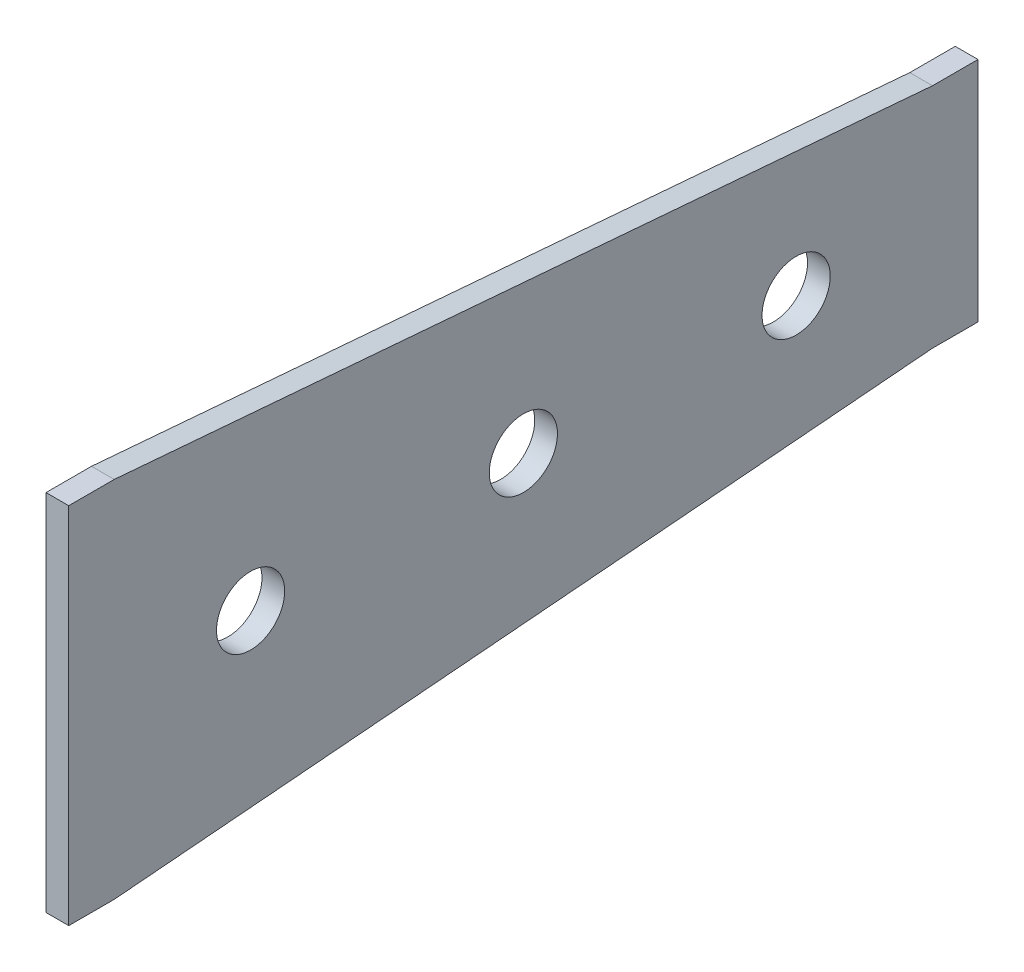
ISO-10303-21;
HEADER;
FILE_DESCRIPTION(('STEP AP214'),'2;1');
FILE_NAME('part.step','',(''),(''),'','','');
FILE_SCHEMA(('AUTOMOTIVE_DESIGN { 1 0 10303 214 1 1 1 1 }'));
ENDSEC;
DATA;
#1=APPLICATION_CONTEXT('core data for automotive mechanical design processes');
#2=APPLICATION_PROTOCOL_DEFINITION('international standard','automotive_design',2000,#1);
#3=PRODUCT_CONTEXT('',#1,'mechanical');
#4=PRODUCT('Part','Part','',(#3));
#5=PRODUCT_RELATED_PRODUCT_CATEGORY('part','',(#4));
#6=PRODUCT_DEFINITION_FORMATION('','',#4);
#7=PRODUCT_DEFINITION_CONTEXT('part definition',#1,'design');
#8=PRODUCT_DEFINITION('design','',#6,#7);
#9=PRODUCT_DEFINITION_SHAPE('','',#8);
#10=(LENGTH_UNIT() NAMED_UNIT(*) SI_UNIT(.MILLI.,.METRE.));
#11=(NAMED_UNIT(*) PLANE_ANGLE_UNIT() SI_UNIT($,.RADIAN.));
#12=(NAMED_UNIT(*) SI_UNIT($,.STERADIAN.) SOLID_ANGLE_UNIT());
#13=UNCERTAINTY_MEASURE_WITH_UNIT(LENGTH_MEASURE(1.E-05),#10,'distance_accuracy_value','');
#14=(GEOMETRIC_REPRESENTATION_CONTEXT(3) GLOBAL_UNCERTAINTY_ASSIGNED_CONTEXT((#13)) GLOBAL_UNIT_ASSIGNED_CONTEXT((#10,
#11,#12)) REPRESENTATION_CONTEXT('',''));
#15=CARTESIAN_POINT('',(0.,0.,0.));
#16=DIRECTION('',(0.,0.,1.));
#17=DIRECTION('',(1.,0.,0.));
#18=AXIS2_PLACEMENT_3D('',#15,#16,#17);
#19=CARTESIAN_POINT('',(2.5,0.,0.));
#20=DIRECTION('',(1.,0.,0.));
#21=DIRECTION('',(0.,0.,-1.));
#22=AXIS2_PLACEMENT_3D('',#19,#20,#21);
#23=PLANE('',#22);
#24=CARTESIAN_POINT('',(2.5,0.,60.));
#25=DIRECTION('',(1.,0.,0.));
#26=DIRECTION('',(0.,0.,-1.));
#27=AXIS2_PLACEMENT_3D('',#24,#25,#26);
#28=CIRCLE('',#27,7.50000000000001);
#29=CARTESIAN_POINT('',(2.5,0.,52.5));
#30=VERTEX_POINT('',#29);
#31=EDGE_CURVE('E222',#30,#30,#28,.T.);
#32=ORIENTED_EDGE('',*,*,#31,.F.);
#33=EDGE_LOOP('',(#32));
#34=FACE_BOUND('',#33,.T.);
#35=DIRECTION('',(0.,0.,1.));
#36=VECTOR('',#35,1.);
#37=CARTESIAN_POINT('',(2.5,40.,100.));
#38=LINE('',#37,#36);
#39=CARTESIAN_POINT('',(2.5,40.,90.));
#40=VERTEX_POINT('',#39);
#41=CARTESIAN_POINT('',(2.5,40.,100.));
#42=VERTEX_POINT('',#41);
#43=EDGE_CURVE('E176',#40,#42,#38,.T.);
#44=ORIENTED_EDGE('',*,*,#43,.T.);
#45=DIRECTION('',(0.,-1.,0.));
#46=VECTOR('',#45,1.);
#47=CARTESIAN_POINT('',(2.5,40.,100.));
#48=LINE('',#47,#46);
#49=CARTESIAN_POINT('',(2.5,-40.,100.));
#50=VERTEX_POINT('',#49);
#51=EDGE_CURVE('E111',#42,#50,#48,.T.);
#52=ORIENTED_EDGE('',*,*,#51,.T.);
#53=DIRECTION('',(0.,0.,-1.));
#54=VECTOR('',#53,1.);
#55=CARTESIAN_POINT('',(2.5,-40.,100.));
#56=LINE('',#55,#54);
#57=CARTESIAN_POINT('',(2.5,-40.,90.));
#58=VERTEX_POINT('',#57);
#59=EDGE_CURVE('E196',#50,#58,#56,.T.);
#60=ORIENTED_EDGE('',*,*,#59,.T.);
#61=DIRECTION('',(0.,0.08304547985374,-0.99654575824488));
#62=VECTOR('',#61,1.);
#63=CARTESIAN_POINT('',(2.5,-25.,-90.));
#64=LINE('',#63,#62);
#65=CARTESIAN_POINT('',(2.5,-25.,-90.));
#66=VERTEX_POINT('',#65);
#67=EDGE_CURVE('E209',#58,#66,#64,.T.);
#68=ORIENTED_EDGE('',*,*,#67,.T.);
#69=DIRECTION('',(0.,0.,-1.));
#70=VECTOR('',#69,1.);
#71=CARTESIAN_POINT('',(2.5,-25.,-100.));
#72=LINE('',#71,#70);
#73=CARTESIAN_POINT('',(2.5,-25.,-100.));
#74=VERTEX_POINT('',#73);
#75=EDGE_CURVE('E131',#66,#74,#72,.T.);
#76=ORIENTED_EDGE('',*,*,#75,.T.);
#77=DIRECTION('',(0.,1.,0.));
#78=VECTOR('',#77,1.);
#79=CARTESIAN_POINT('',(2.5,-25.,-100.));
#80=LINE('',#79,#78);
#81=CARTESIAN_POINT('',(2.5,25.,-100.));
#82=VERTEX_POINT('',#81);
#83=EDGE_CURVE('E125',#74,#82,#80,.T.);
#84=ORIENTED_EDGE('',*,*,#83,.T.);
#85=DIRECTION('',(0.,0.,1.));
#86=VECTOR('',#85,1.);
#87=CARTESIAN_POINT('',(2.5,25.,-100.));
#88=LINE('',#87,#86);
#89=CARTESIAN_POINT('',(2.5,25.,-90.));
#90=VERTEX_POINT('',#89);
#91=EDGE_CURVE('E129',#82,#90,#88,.T.);
#92=ORIENTED_EDGE('',*,*,#91,.T.);
#93=DIRECTION('',(0.,0.08304547985374,0.99654575824488));
#94=VECTOR('',#93,1.);
#95=CARTESIAN_POINT('',(2.5,25.,-90.));
#96=LINE('',#95,#94);
#97=EDGE_CURVE('E60',#90,#40,#96,.T.);
#98=ORIENTED_EDGE('',*,*,#97,.T.);
#99=EDGE_LOOP('',(#44,#52,#60,#68,#76,#84,#92,#98));
#100=FACE_BOUND('',#99,.T.);
#101=CARTESIAN_POINT('',(2.5,0.,0.));
#102=DIRECTION('',(1.,0.,0.));
#103=DIRECTION('',(0.,0.,-1.));
#104=AXIS2_PLACEMENT_3D('',#101,#102,#103);
#105=CIRCLE('',#104,7.5);
#106=CARTESIAN_POINT('',(2.5,0.,-7.5));
#107=VERTEX_POINT('',#106);
#108=EDGE_CURVE('E160',#107,#107,#105,.T.);
#109=ORIENTED_EDGE('',*,*,#108,.F.);
#110=EDGE_LOOP('',(#109));
#111=FACE_BOUND('',#110,.T.);
#112=CARTESIAN_POINT('',(2.5,0.,-60.));
#113=DIRECTION('',(1.,0.,0.));
#114=DIRECTION('',(0.,0.,-1.));
#115=AXIS2_PLACEMENT_3D('',#112,#113,#114);
#116=CIRCLE('',#115,7.50000000000001);
#117=CARTESIAN_POINT('',(2.5,0.,-67.5));
#118=VERTEX_POINT('',#117);
#119=EDGE_CURVE('E230',#118,#118,#116,.T.);
#120=ORIENTED_EDGE('',*,*,#119,.F.);
#121=EDGE_LOOP('',(#120));
#122=FACE_BOUND('',#121,.T.);
#123=ADVANCED_FACE('F39',(#34,#100,#111,#122),#23,.T.);
#124=CARTESIAN_POINT('',(-2.5,0.,0.));
#125=DIRECTION('',(1.,0.,0.));
#126=DIRECTION('',(0.,0.,-1.));
#127=AXIS2_PLACEMENT_3D('',#124,#125,#126);
#128=PLANE('',#127);
#129=DIRECTION('',(0.,0.,1.));
#130=VECTOR('',#129,1.);
#131=CARTESIAN_POINT('',(-2.5,40.,100.));
#132=LINE('',#131,#130);
#133=CARTESIAN_POINT('',(-2.5,40.,90.));
#134=VERTEX_POINT('',#133);
#135=CARTESIAN_POINT('',(-2.5,40.,100.));
#136=VERTEX_POINT('',#135);
#137=EDGE_CURVE('E155',#134,#136,#132,.T.);
#138=ORIENTED_EDGE('',*,*,#137,.F.);
#139=DIRECTION('',(0.,0.08304547985374,0.99654575824488));
#140=VECTOR('',#139,1.);
#141=CARTESIAN_POINT('',(-2.5,25.,-90.));
#142=LINE('',#141,#140);
#143=CARTESIAN_POINT('',(-2.5,25.,-90.));
#144=VERTEX_POINT('',#143);
#145=EDGE_CURVE('E103',#144,#134,#142,.T.);
#146=ORIENTED_EDGE('',*,*,#145,.F.);
#147=DIRECTION('',(0.,0.,1.));
#148=VECTOR('',#147,1.);
#149=CARTESIAN_POINT('',(-2.5,25.,-100.));
#150=LINE('',#149,#148);
#151=CARTESIAN_POINT('',(-2.5,25.,-100.));
#152=VERTEX_POINT('',#151);
#153=EDGE_CURVE('E95',#152,#144,#150,.T.);
#154=ORIENTED_EDGE('',*,*,#153,.F.);
#155=DIRECTION('',(0.,1.,0.));
#156=VECTOR('',#155,1.);
#157=CARTESIAN_POINT('',(-2.5,-25.,-100.));
#158=LINE('',#157,#156);
#159=CARTESIAN_POINT('',(-2.5,-25.,-100.));
#160=VERTEX_POINT('',#159);
#161=EDGE_CURVE('E140',#160,#152,#158,.T.);
#162=ORIENTED_EDGE('',*,*,#161,.F.);
#163=DIRECTION('',(0.,0.,-1.));
#164=VECTOR('',#163,1.);
#165=CARTESIAN_POINT('',(-2.5,-25.,-100.));
#166=LINE('',#165,#164);
#167=CARTESIAN_POINT('',(-2.5,-25.,-90.));
#168=VERTEX_POINT('',#167);
#169=EDGE_CURVE('E169',#168,#160,#166,.T.);
#170=ORIENTED_EDGE('',*,*,#169,.F.);
#171=DIRECTION('',(0.,0.08304547985374,-0.99654575824488));
#172=VECTOR('',#171,1.);
#173=CARTESIAN_POINT('',(-2.5,-25.,-90.));
#174=LINE('',#173,#172);
#175=CARTESIAN_POINT('',(-2.5,-40.,90.));
#176=VERTEX_POINT('',#175);
#177=EDGE_CURVE('E166',#176,#168,#174,.T.);
#178=ORIENTED_EDGE('',*,*,#177,.F.);
#179=DIRECTION('',(0.,0.,-1.));
#180=VECTOR('',#179,1.);
#181=CARTESIAN_POINT('',(-2.5,-40.,100.));
#182=LINE('',#181,#180);
#183=CARTESIAN_POINT('',(-2.5,-40.,100.));
#184=VERTEX_POINT('',#183);
#185=EDGE_CURVE('E163',#184,#176,#182,.T.);
#186=ORIENTED_EDGE('',*,*,#185,.F.);
#187=DIRECTION('',(0.,-1.,0.));
#188=VECTOR('',#187,1.);
#189=CARTESIAN_POINT('',(-2.5,40.,100.));
#190=LINE('',#189,#188);
#191=EDGE_CURVE('E159',#136,#184,#190,.T.);
#192=ORIENTED_EDGE('',*,*,#191,.F.);
#193=EDGE_LOOP('',(#138,#146,#154,#162,#170,#178,#186,#192));
#194=FACE_BOUND('',#193,.T.);
#195=CARTESIAN_POINT('',(-2.5,0.,0.));
#196=DIRECTION('',(1.,0.,0.));
#197=DIRECTION('',(0.,0.,-1.));
#198=AXIS2_PLACEMENT_3D('',#195,#196,#197);
#199=CIRCLE('',#198,7.5);
#200=CARTESIAN_POINT('',(-2.5,0.,-7.5));
#201=VERTEX_POINT('',#200);
#202=EDGE_CURVE('E218',#201,#201,#199,.T.);
#203=ORIENTED_EDGE('',*,*,#202,.T.);
#204=EDGE_LOOP('',(#203));
#205=FACE_BOUND('',#204,.T.);
#206=CARTESIAN_POINT('',(-2.5,0.,60.));
#207=DIRECTION('',(1.,0.,0.));
#208=DIRECTION('',(0.,0.,-1.));
#209=AXIS2_PLACEMENT_3D('',#206,#207,#208);
#210=CIRCLE('',#209,7.50000000000001);
#211=CARTESIAN_POINT('',(-2.5,0.,52.5));
#212=VERTEX_POINT('',#211);
#213=EDGE_CURVE('E226',#212,#212,#210,.T.);
#214=ORIENTED_EDGE('',*,*,#213,.T.);
#215=EDGE_LOOP('',(#214));
#216=FACE_BOUND('',#215,.T.);
#217=CARTESIAN_POINT('',(-2.5,0.,-60.));
#218=DIRECTION('',(1.,0.,0.));
#219=DIRECTION('',(0.,0.,-1.));
#220=AXIS2_PLACEMENT_3D('',#217,#218,#219);
#221=CIRCLE('',#220,7.50000000000001);
#222=CARTESIAN_POINT('',(-2.5,0.,-67.5));
#223=VERTEX_POINT('',#222);
#224=EDGE_CURVE('E234',#223,#223,#221,.T.);
#225=ORIENTED_EDGE('',*,*,#224,.T.);
#226=EDGE_LOOP('',(#225));
#227=FACE_BOUND('',#226,.T.);
#228=ADVANCED_FACE('F200',(#194,#205,#216,#227),#128,.F.);
#229=CARTESIAN_POINT('',(2.5,40.,100.));
#230=DIRECTION('',(0.,-1.,0.));
#231=DIRECTION('',(0.,0.,-1.));
#232=AXIS2_PLACEMENT_3D('',#229,#230,#231);
#233=PLANE('',#232);
#234=ORIENTED_EDGE('',*,*,#137,.T.);
#235=DIRECTION('',(-1.,0.,0.));
#236=VECTOR('',#235,1.);
#237=CARTESIAN_POINT('',(2.5,40.,100.));
#238=LINE('',#237,#236);
#239=EDGE_CURVE('E11',#42,#136,#238,.T.);
#240=ORIENTED_EDGE('',*,*,#239,.F.);
#241=ORIENTED_EDGE('',*,*,#43,.F.);
#242=DIRECTION('',(-1.,0.,0.));
#243=VECTOR('',#242,1.);
#244=CARTESIAN_POINT('',(2.5,40.,90.));
#245=LINE('',#244,#243);
#246=EDGE_CURVE('E151',#40,#134,#245,.T.);
#247=ORIENTED_EDGE('',*,*,#246,.T.);
#248=EDGE_LOOP('',(#234,#240,#241,#247));
#249=FACE_BOUND('',#248,.T.);
#250=ADVANCED_FACE('F41',(#249),#233,.F.);
#251=CARTESIAN_POINT('',(2.5,40.,100.));
#252=DIRECTION('',(0.,0.,-1.));
#253=DIRECTION('',(-1.,0.,0.));
#254=AXIS2_PLACEMENT_3D('',#251,#252,#253);
#255=PLANE('',#254);
#256=ORIENTED_EDGE('',*,*,#191,.T.);
#257=DIRECTION('',(-1.,0.,0.));
#258=VECTOR('',#257,1.);
#259=CARTESIAN_POINT('',(2.5,-40.,100.));
#260=LINE('',#259,#258);
#261=EDGE_CURVE('E49',#50,#184,#260,.T.);
#262=ORIENTED_EDGE('',*,*,#261,.F.);
#263=ORIENTED_EDGE('',*,*,#51,.F.);
#264=ORIENTED_EDGE('',*,*,#239,.T.);
#265=EDGE_LOOP('',(#256,#262,#263,#264));
#266=FACE_BOUND('',#265,.T.);
#267=ADVANCED_FACE('F268',(#266),#255,.F.);
#268=CARTESIAN_POINT('',(2.5,-40.,100.));
#269=DIRECTION('',(0.,1.,0.));
#270=DIRECTION('',(0.,0.,1.));
#271=AXIS2_PLACEMENT_3D('',#268,#269,#270);
#272=PLANE('',#271);
#273=ORIENTED_EDGE('',*,*,#185,.T.);
#274=DIRECTION('',(-1.,0.,0.));
#275=VECTOR('',#274,1.);
#276=CARTESIAN_POINT('',(2.5,-40.,90.));
#277=LINE('',#276,#275);
#278=EDGE_CURVE('E184',#58,#176,#277,.T.);
#279=ORIENTED_EDGE('',*,*,#278,.F.);
#280=ORIENTED_EDGE('',*,*,#59,.F.);
#281=ORIENTED_EDGE('',*,*,#261,.T.);
#282=EDGE_LOOP('',(#273,#279,#280,#281));
#283=FACE_BOUND('',#282,.T.);
#284=ADVANCED_FACE('F194',(#283),#272,.F.);
#285=CARTESIAN_POINT('',(2.5,-25.,-90.));
#286=DIRECTION('',(0.,0.99654575824488,0.08304547985374));
#287=DIRECTION('',(0.,-0.08304547985374,0.99654575824488));
#288=AXIS2_PLACEMENT_3D('',#285,#286,#287);
#289=PLANE('',#288);
#290=ORIENTED_EDGE('',*,*,#177,.T.);
#291=DIRECTION('',(-1.,0.,0.));
#292=VECTOR('',#291,1.);
#293=CARTESIAN_POINT('',(2.5,-25.,-90.));
#294=LINE('',#293,#292);
#295=EDGE_CURVE('E181',#66,#168,#294,.T.);
#296=ORIENTED_EDGE('',*,*,#295,.F.);
#297=ORIENTED_EDGE('',*,*,#67,.F.);
#298=ORIENTED_EDGE('',*,*,#278,.T.);
#299=EDGE_LOOP('',(#290,#296,#297,#298));
#300=FACE_BOUND('',#299,.T.);
#301=ADVANCED_FACE('F205',(#300),#289,.F.);
#302=CARTESIAN_POINT('',(2.5,-25.,-100.));
#303=DIRECTION('',(0.,1.,0.));
#304=DIRECTION('',(0.,0.,1.));
#305=AXIS2_PLACEMENT_3D('',#302,#303,#304);
#306=PLANE('',#305);
#307=ORIENTED_EDGE('',*,*,#169,.T.);
#308=DIRECTION('',(-1.,0.,0.));
#309=VECTOR('',#308,1.);
#310=CARTESIAN_POINT('',(2.5,-25.,-100.));
#311=LINE('',#310,#309);
#312=EDGE_CURVE('E142',#74,#160,#311,.T.);
#313=ORIENTED_EDGE('',*,*,#312,.F.);
#314=ORIENTED_EDGE('',*,*,#75,.F.);
#315=ORIENTED_EDGE('',*,*,#295,.T.);
#316=EDGE_LOOP('',(#307,#313,#314,#315));
#317=FACE_BOUND('',#316,.T.);
#318=ADVANCED_FACE('F208',(#317),#306,.F.);
#319=CARTESIAN_POINT('',(2.5,-25.,-100.));
#320=DIRECTION('',(0.,0.,1.));
#321=DIRECTION('',(1.,0.,0.));
#322=AXIS2_PLACEMENT_3D('',#319,#320,#321);
#323=PLANE('',#322);
#324=ORIENTED_EDGE('',*,*,#161,.T.);
#325=DIRECTION('',(-1.,0.,0.));
#326=VECTOR('',#325,1.);
#327=CARTESIAN_POINT('',(2.5,25.,-100.));
#328=LINE('',#327,#326);
#329=EDGE_CURVE('E137',#82,#152,#328,.T.);
#330=ORIENTED_EDGE('',*,*,#329,.F.);
#331=ORIENTED_EDGE('',*,*,#83,.F.);
#332=ORIENTED_EDGE('',*,*,#312,.T.);
#333=EDGE_LOOP('',(#324,#330,#331,#332));
#334=FACE_BOUND('',#333,.T.);
#335=ADVANCED_FACE('F138',(#334),#323,.F.);
#336=CARTESIAN_POINT('',(2.5,25.,-100.));
#337=DIRECTION('',(0.,-1.,0.));
#338=DIRECTION('',(0.,0.,-1.));
#339=AXIS2_PLACEMENT_3D('',#336,#337,#338);
#340=PLANE('',#339);
#341=ORIENTED_EDGE('',*,*,#153,.T.);
#342=DIRECTION('',(-1.,0.,0.));
#343=VECTOR('',#342,1.);
#344=CARTESIAN_POINT('',(2.5,25.,-90.));
#345=LINE('',#344,#343);
#346=EDGE_CURVE('E143',#90,#144,#345,.T.);
#347=ORIENTED_EDGE('',*,*,#346,.F.);
#348=ORIENTED_EDGE('',*,*,#91,.F.);
#349=ORIENTED_EDGE('',*,*,#329,.T.);
#350=EDGE_LOOP('',(#341,#347,#348,#349));
#351=FACE_BOUND('',#350,.T.);
#352=ADVANCED_FACE('F145',(#351),#340,.F.);
#353=CARTESIAN_POINT('',(2.5,25.,-90.));
#354=DIRECTION('',(0.,-0.99654575824488,0.08304547985374));
#355=DIRECTION('',(0.,-0.08304547985374,-0.99654575824488));
#356=AXIS2_PLACEMENT_3D('',#353,#354,#355);
#357=PLANE('',#356);
#358=ORIENTED_EDGE('',*,*,#145,.T.);
#359=ORIENTED_EDGE('',*,*,#246,.F.);
#360=ORIENTED_EDGE('',*,*,#97,.F.);
#361=ORIENTED_EDGE('',*,*,#346,.T.);
#362=EDGE_LOOP('',(#358,#359,#360,#361));
#363=FACE_BOUND('',#362,.T.);
#364=ADVANCED_FACE('F256',(#363),#357,.F.);
#365=CARTESIAN_POINT('',(2.5,0.,0.));
#366=DIRECTION('',(-1.,0.,0.));
#367=DIRECTION('',(0.,0.,1.));
#368=AXIS2_PLACEMENT_3D('',#365,#366,#367);
#369=CYLINDRICAL_SURFACE('',#368,7.5);
#370=ORIENTED_EDGE('',*,*,#108,.T.);
#371=EDGE_LOOP('',(#370));
#372=FACE_BOUND('',#371,.T.);
#373=ORIENTED_EDGE('',*,*,#202,.F.);
#374=EDGE_LOOP('',(#373));
#375=FACE_BOUND('',#374,.T.);
#376=ADVANCED_FACE('F253',(#372,#375),#369,.F.);
#377=CARTESIAN_POINT('',(2.5,0.,60.));
#378=DIRECTION('',(-1.,0.,0.));
#379=DIRECTION('',(0.,0.,1.));
#380=AXIS2_PLACEMENT_3D('',#377,#378,#379);
#381=CYLINDRICAL_SURFACE('',#380,7.50000000000001);
#382=ORIENTED_EDGE('',*,*,#31,.T.);
#383=EDGE_LOOP('',(#382));
#384=FACE_BOUND('',#383,.T.);
#385=ORIENTED_EDGE('',*,*,#213,.F.);
#386=EDGE_LOOP('',(#385));
#387=FACE_BOUND('',#386,.T.);
#388=ADVANCED_FACE('F328',(#384,#387),#381,.F.);
#389=CARTESIAN_POINT('',(2.5,0.,-60.));
#390=DIRECTION('',(-1.,0.,0.));
#391=DIRECTION('',(0.,0.,1.));
#392=AXIS2_PLACEMENT_3D('',#389,#390,#391);
#393=CYLINDRICAL_SURFACE('',#392,7.50000000000001);
#394=ORIENTED_EDGE('',*,*,#119,.T.);
#395=EDGE_LOOP('',(#394));
#396=FACE_BOUND('',#395,.T.);
#397=ORIENTED_EDGE('',*,*,#224,.F.);
#398=EDGE_LOOP('',(#397));
#399=FACE_BOUND('',#398,.T.);
#400=ADVANCED_FACE('F241',(#396,#399),#393,.F.);
#401=CLOSED_SHELL('',(#123,#228,#250,#267,#284,#301,#318,#335,#352,#364,#376,#388,#400));
#402=MANIFOLD_SOLID_BREP('B2',#401);
#403=ADVANCED_BREP_SHAPE_REPRESENTATION('',(#18,#402),#14);
#404=SHAPE_DEFINITION_REPRESENTATION(#9,#403);
ENDSEC;
END-ISO-10303-21;
